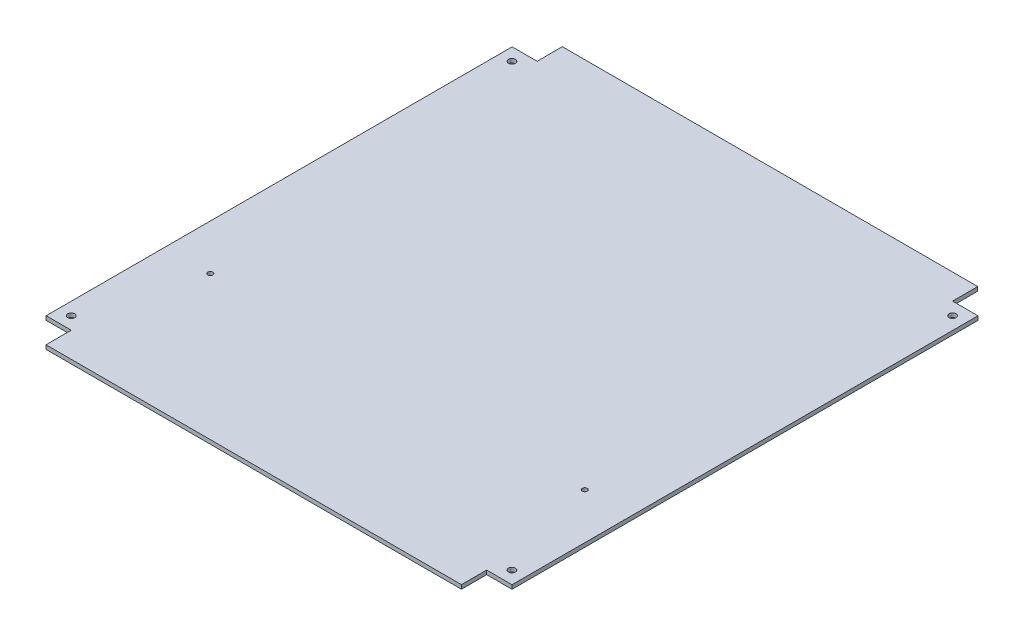
ISO-10303-21;
HEADER;
FILE_DESCRIPTION(('STEP AP214'),'2;1');
FILE_NAME('part.step','',(''),(''),'','','');
FILE_SCHEMA(('AUTOMOTIVE_DESIGN { 1 0 10303 214 1 1 1 1 }'));
ENDSEC;
DATA;
#1=APPLICATION_CONTEXT('core data for automotive mechanical design processes');
#2=APPLICATION_PROTOCOL_DEFINITION('international standard','automotive_design',2000,#1);
#3=PRODUCT_CONTEXT('',#1,'mechanical');
#4=PRODUCT('Part','Part','',(#3));
#5=PRODUCT_RELATED_PRODUCT_CATEGORY('part','',(#4));
#6=PRODUCT_DEFINITION_FORMATION('','',#4);
#7=PRODUCT_DEFINITION_CONTEXT('part definition',#1,'design');
#8=PRODUCT_DEFINITION('design','',#6,#7);
#9=PRODUCT_DEFINITION_SHAPE('','',#8);
#10=(LENGTH_UNIT() NAMED_UNIT(*) SI_UNIT(.MILLI.,.METRE.));
#11=(NAMED_UNIT(*) PLANE_ANGLE_UNIT() SI_UNIT($,.RADIAN.));
#12=(NAMED_UNIT(*) SI_UNIT($,.STERADIAN.) SOLID_ANGLE_UNIT());
#13=UNCERTAINTY_MEASURE_WITH_UNIT(LENGTH_MEASURE(1.E-05),#10,'distance_accuracy_value','');
#14=(GEOMETRIC_REPRESENTATION_CONTEXT(3) GLOBAL_UNCERTAINTY_ASSIGNED_CONTEXT((#13)) GLOBAL_UNIT_ASSIGNED_CONTEXT((#10,
#11,#12)) REPRESENTATION_CONTEXT('',''));
#15=CARTESIAN_POINT('',(0.,0.,0.));
#16=DIRECTION('',(0.,0.,1.));
#17=DIRECTION('',(1.,0.,0.));
#18=AXIS2_PLACEMENT_3D('',#15,#16,#17);
#19=CARTESIAN_POINT('',(164.819359939751,3.175,204.974359939332));
#20=DIRECTION('',(0.,0.,-1.));
#21=DIRECTION('',(-1.,0.,0.));
#22=AXIS2_PLACEMENT_3D('',#19,#20,#21);
#23=PLANE('',#22);
#24=DIRECTION('',(1.,0.,0.));
#25=VECTOR('',#24,1.);
#26=CARTESIAN_POINT('',(164.819359939751,0.,204.974359939332));
#27=LINE('',#26,#25);
#28=CARTESIAN_POINT('',(-164.755640060249,0.,204.974359939332));
#29=VERTEX_POINT('',#28);
#30=CARTESIAN_POINT('',(164.819359939751,0.,204.974359939332));
#31=VERTEX_POINT('',#30);
#32=EDGE_CURVE('E110',#29,#31,#27,.T.);
#33=ORIENTED_EDGE('',*,*,#32,.T.);
#34=DIRECTION('',(0.,-1.,0.));
#35=VECTOR('',#34,1.);
#36=CARTESIAN_POINT('',(164.819359939751,3.175,204.974359939332));
#37=LINE('',#36,#35);
#38=CARTESIAN_POINT('',(164.819359939751,3.175,204.974359939332));
#39=VERTEX_POINT('',#38);
#40=EDGE_CURVE('E11',#39,#31,#37,.T.);
#41=ORIENTED_EDGE('',*,*,#40,.F.);
#42=DIRECTION('',(1.,0.,0.));
#43=VECTOR('',#42,1.);
#44=CARTESIAN_POINT('',(-163.362720716725,3.175,204.974359939332));
#45=LINE('',#44,#43);
#46=CARTESIAN_POINT('',(-164.755640060249,3.175,204.974359939332));
#47=VERTEX_POINT('',#46);
#48=EDGE_CURVE('E116',#47,#39,#45,.T.);
#49=ORIENTED_EDGE('',*,*,#48,.F.);
#50=DIRECTION('',(0.,-1.,0.));
#51=VECTOR('',#50,1.);
#52=CARTESIAN_POINT('',(-164.755640060249,3.175,204.974359939332));
#53=LINE('',#52,#51);
#54=EDGE_CURVE('E166',#47,#29,#53,.T.);
#55=ORIENTED_EDGE('',*,*,#54,.T.);
#56=EDGE_LOOP('',(#33,#41,#49,#55));
#57=FACE_BOUND('',#56,.T.);
#58=ADVANCED_FACE('F45',(#57),#23,.F.);
#59=CARTESIAN_POINT('',(164.819359939751,3.175,184.974359939332));
#60=DIRECTION('',(-1.,0.,0.));
#61=DIRECTION('',(0.,0.,1.));
#62=AXIS2_PLACEMENT_3D('',#59,#60,#61);
#63=PLANE('',#62);
#64=DIRECTION('',(0.,0.,-1.));
#65=VECTOR('',#64,1.);
#66=CARTESIAN_POINT('',(164.819359939751,0.,184.974359939332));
#67=LINE('',#66,#65);
#68=CARTESIAN_POINT('',(164.819359939751,0.,184.974359939332));
#69=VERTEX_POINT('',#68);
#70=EDGE_CURVE('E172',#31,#69,#67,.T.);
#71=ORIENTED_EDGE('',*,*,#70,.T.);
#72=DIRECTION('',(0.,-1.,0.));
#73=VECTOR('',#72,1.);
#74=CARTESIAN_POINT('',(164.819359939751,3.175,184.974359939332));
#75=LINE('',#74,#73);
#76=CARTESIAN_POINT('',(164.819359939751,3.175,184.974359939332));
#77=VERTEX_POINT('',#76);
#78=EDGE_CURVE('E54',#77,#69,#75,.T.);
#79=ORIENTED_EDGE('',*,*,#78,.F.);
#80=DIRECTION('',(0.,0.,-1.));
#81=VECTOR('',#80,1.);
#82=CARTESIAN_POINT('',(164.819359939751,3.175,184.974359939332));
#83=LINE('',#82,#81);
#84=EDGE_CURVE('E289',#39,#77,#83,.T.);
#85=ORIENTED_EDGE('',*,*,#84,.F.);
#86=ORIENTED_EDGE('',*,*,#40,.T.);
#87=EDGE_LOOP('',(#71,#79,#85,#86));
#88=FACE_BOUND('',#87,.T.);
#89=ADVANCED_FACE('F296',(#88),#63,.F.);
#90=CARTESIAN_POINT('',(184.929359939613,3.175,184.974359939332));
#91=DIRECTION('',(0.,0.,-1.));
#92=DIRECTION('',(-1.,0.,0.));
#93=AXIS2_PLACEMENT_3D('',#90,#91,#92);
#94=PLANE('',#93);
#95=DIRECTION('',(1.,0.,0.));
#96=VECTOR('',#95,1.);
#97=CARTESIAN_POINT('',(184.929359939613,0.,184.974359939332));
#98=LINE('',#97,#96);
#99=CARTESIAN_POINT('',(184.929359939613,0.,184.974359939332));
#100=VERTEX_POINT('',#99);
#101=EDGE_CURVE('E176',#69,#100,#98,.T.);
#102=ORIENTED_EDGE('',*,*,#101,.T.);
#103=DIRECTION('',(0.,-1.,0.));
#104=VECTOR('',#103,1.);
#105=CARTESIAN_POINT('',(184.929359939613,3.175,184.974359939332));
#106=LINE('',#105,#104);
#107=CARTESIAN_POINT('',(184.929359939613,3.175,184.974359939332));
#108=VERTEX_POINT('',#107);
#109=EDGE_CURVE('E231',#108,#100,#106,.T.);
#110=ORIENTED_EDGE('',*,*,#109,.F.);
#111=DIRECTION('',(1.,0.,0.));
#112=VECTOR('',#111,1.);
#113=CARTESIAN_POINT('',(184.929359939613,3.175,184.974359939332));
#114=LINE('',#113,#112);
#115=EDGE_CURVE('E242',#77,#108,#114,.T.);
#116=ORIENTED_EDGE('',*,*,#115,.F.);
#117=ORIENTED_EDGE('',*,*,#78,.T.);
#118=EDGE_LOOP('',(#102,#110,#116,#117));
#119=FACE_BOUND('',#118,.T.);
#120=ADVANCED_FACE('F240',(#119),#94,.F.);
#121=CARTESIAN_POINT('',(185.019359939556,3.175,-184.610640060281));
#122=DIRECTION('',(-0.999999970349889,0.,-0.000243516369101674));
#123=DIRECTION('',(-0.000243516369101674,0.,0.999999970349889));
#124=AXIS2_PLACEMENT_3D('',#121,#122,#123);
#125=PLANE('',#124);
#126=DIRECTION('',(0.000243516369101674,0.,-0.999999970349889));
#127=VECTOR('',#126,1.);
#128=CARTESIAN_POINT('',(185.019359939556,0.,-184.610640060281));
#129=LINE('',#128,#127);
#130=CARTESIAN_POINT('',(185.019359939556,0.,-184.610640060281));
#131=VERTEX_POINT('',#130);
#132=EDGE_CURVE('E179',#100,#131,#129,.T.);
#133=ORIENTED_EDGE('',*,*,#132,.T.);
#134=DIRECTION('',(0.,-1.,0.));
#135=VECTOR('',#134,1.);
#136=CARTESIAN_POINT('',(185.019359939556,3.175,-184.610640060281));
#137=LINE('',#136,#135);
#138=CARTESIAN_POINT('',(185.019359939556,3.175,-184.610640060281));
#139=VERTEX_POINT('',#138);
#140=EDGE_CURVE('E227',#139,#131,#137,.T.);
#141=ORIENTED_EDGE('',*,*,#140,.F.);
#142=DIRECTION('',(0.000243516369101674,0.,-0.999999970349889));
#143=VECTOR('',#142,1.);
#144=CARTESIAN_POINT('',(185.019359939556,3.175,-184.610640060281));
#145=LINE('',#144,#143);
#146=EDGE_CURVE('E261',#108,#139,#145,.T.);
#147=ORIENTED_EDGE('',*,*,#146,.F.);
#148=ORIENTED_EDGE('',*,*,#109,.T.);
#149=EDGE_LOOP('',(#133,#141,#147,#148));
#150=FACE_BOUND('',#149,.T.);
#151=ADVANCED_FACE('F251',(#150),#125,.F.);
#152=CARTESIAN_POINT('',(164.819359939752,3.175,-184.610640060281));
#153=DIRECTION('',(0.,0.,1.));
#154=DIRECTION('',(1.,0.,0.));
#155=AXIS2_PLACEMENT_3D('',#152,#153,#154);
#156=PLANE('',#155);
#157=DIRECTION('',(-1.,0.,0.));
#158=VECTOR('',#157,1.);
#159=CARTESIAN_POINT('',(164.819359939752,0.,-184.610640060281));
#160=LINE('',#159,#158);
#161=CARTESIAN_POINT('',(164.819359939752,0.,-184.610640060281));
#162=VERTEX_POINT('',#161);
#163=EDGE_CURVE('E182',#131,#162,#160,.T.);
#164=ORIENTED_EDGE('',*,*,#163,.T.);
#165=DIRECTION('',(0.,-1.,0.));
#166=VECTOR('',#165,1.);
#167=CARTESIAN_POINT('',(164.819359939752,3.175,-184.610640060281));
#168=LINE('',#167,#166);
#169=CARTESIAN_POINT('',(164.819359939752,3.175,-184.610640060281));
#170=VERTEX_POINT('',#169);
#171=EDGE_CURVE('E223',#170,#162,#168,.T.);
#172=ORIENTED_EDGE('',*,*,#171,.F.);
#173=DIRECTION('',(-1.,0.,0.));
#174=VECTOR('',#173,1.);
#175=CARTESIAN_POINT('',(164.819359939752,3.175,-184.610640060281));
#176=LINE('',#175,#174);
#177=EDGE_CURVE('E257',#139,#170,#176,.T.);
#178=ORIENTED_EDGE('',*,*,#177,.F.);
#179=ORIENTED_EDGE('',*,*,#140,.T.);
#180=EDGE_LOOP('',(#164,#172,#178,#179));
#181=FACE_BOUND('',#180,.T.);
#182=ADVANCED_FACE('F255',(#181),#156,.F.);
#183=CARTESIAN_POINT('',(164.819359939752,3.175,-204.610640060181));
#184=DIRECTION('',(-1.,0.,0.));
#185=DIRECTION('',(0.,0.,1.));
#186=AXIS2_PLACEMENT_3D('',#183,#184,#185);
#187=PLANE('',#186);
#188=DIRECTION('',(0.,0.,-1.));
#189=VECTOR('',#188,1.);
#190=CARTESIAN_POINT('',(164.819359939752,0.,-204.610640060181));
#191=LINE('',#190,#189);
#192=CARTESIAN_POINT('',(164.819359939752,0.,-204.610640060181));
#193=VERTEX_POINT('',#192);
#194=EDGE_CURVE('E185',#162,#193,#191,.T.);
#195=ORIENTED_EDGE('',*,*,#194,.T.);
#196=DIRECTION('',(0.,-1.,0.));
#197=VECTOR('',#196,1.);
#198=CARTESIAN_POINT('',(164.819359939752,3.175,-204.610640060181));
#199=LINE('',#198,#197);
#200=CARTESIAN_POINT('',(164.819359939752,3.175,-204.610640060181));
#201=VERTEX_POINT('',#200);
#202=EDGE_CURVE('E219',#201,#193,#199,.T.);
#203=ORIENTED_EDGE('',*,*,#202,.F.);
#204=DIRECTION('',(0.,0.,-1.));
#205=VECTOR('',#204,1.);
#206=CARTESIAN_POINT('',(164.819359939752,3.175,-204.610640060181));
#207=LINE('',#206,#205);
#208=EDGE_CURVE('E260',#170,#201,#207,.T.);
#209=ORIENTED_EDGE('',*,*,#208,.F.);
#210=ORIENTED_EDGE('',*,*,#171,.T.);
#211=EDGE_LOOP('',(#195,#203,#209,#210));
#212=FACE_BOUND('',#211,.T.);
#213=ADVANCED_FACE('F308',(#212),#187,.F.);
#214=CARTESIAN_POINT('',(-164.755640060248,3.175,-204.610640060181));
#215=DIRECTION('',(0.,0.,1.));
#216=DIRECTION('',(1.,0.,0.));
#217=AXIS2_PLACEMENT_3D('',#214,#215,#216);
#218=PLANE('',#217);
#219=DIRECTION('',(-1.,0.,0.));
#220=VECTOR('',#219,1.);
#221=CARTESIAN_POINT('',(-164.755640060248,0.,-204.610640060181));
#222=LINE('',#221,#220);
#223=CARTESIAN_POINT('',(-164.755640060248,0.,-204.610640060181));
#224=VERTEX_POINT('',#223);
#225=EDGE_CURVE('E188',#193,#224,#222,.T.);
#226=ORIENTED_EDGE('',*,*,#225,.T.);
#227=DIRECTION('',(0.,-1.,0.));
#228=VECTOR('',#227,1.);
#229=CARTESIAN_POINT('',(-164.755640060248,3.175,-204.610640060181));
#230=LINE('',#229,#228);
#231=CARTESIAN_POINT('',(-164.755640060248,3.175,-204.610640060181));
#232=VERTEX_POINT('',#231);
#233=EDGE_CURVE('E215',#232,#224,#230,.T.);
#234=ORIENTED_EDGE('',*,*,#233,.F.);
#235=DIRECTION('',(-1.,0.,0.));
#236=VECTOR('',#235,1.);
#237=CARTESIAN_POINT('',(-164.755640060248,3.175,-204.610640060181));
#238=LINE('',#237,#236);
#239=EDGE_CURVE('E265',#201,#232,#238,.T.);
#240=ORIENTED_EDGE('',*,*,#239,.F.);
#241=ORIENTED_EDGE('',*,*,#202,.T.);
#242=EDGE_LOOP('',(#226,#234,#240,#241));
#243=FACE_BOUND('',#242,.T.);
#244=ADVANCED_FACE('F311',(#243),#218,.F.);
#245=CARTESIAN_POINT('',(-164.655640060405,3.175,-184.61064006028));
#246=DIRECTION('',(0.999987500234409,0.,-0.0049999374933707));
#247=DIRECTION('',(-0.0049999374933707,0.,-0.999987500234409));
#248=AXIS2_PLACEMENT_3D('',#245,#246,#247);
#249=PLANE('',#248);
#250=DIRECTION('',(0.0049999374933707,0.,0.999987500234409));
#251=VECTOR('',#250,1.);
#252=CARTESIAN_POINT('',(-164.655640060405,0.,-184.61064006028));
#253=LINE('',#252,#251);
#254=CARTESIAN_POINT('',(-164.655640060405,0.,-184.61064006028));
#255=VERTEX_POINT('',#254);
#256=EDGE_CURVE('E191',#224,#255,#253,.T.);
#257=ORIENTED_EDGE('',*,*,#256,.T.);
#258=DIRECTION('',(0.,-1.,0.));
#259=VECTOR('',#258,1.);
#260=CARTESIAN_POINT('',(-164.655640060405,3.175,-184.61064006028));
#261=LINE('',#260,#259);
#262=CARTESIAN_POINT('',(-164.655640060405,3.175,-184.61064006028));
#263=VERTEX_POINT('',#262);
#264=EDGE_CURVE('E211',#263,#255,#261,.T.);
#265=ORIENTED_EDGE('',*,*,#264,.F.);
#266=DIRECTION('',(0.0049999374933707,0.,0.999987500234409));
#267=VECTOR('',#266,1.);
#268=CARTESIAN_POINT('',(-164.655640060405,3.175,-184.61064006028));
#269=LINE('',#268,#267);
#270=EDGE_CURVE('E272',#232,#263,#269,.T.);
#271=ORIENTED_EDGE('',*,*,#270,.F.);
#272=ORIENTED_EDGE('',*,*,#233,.T.);
#273=EDGE_LOOP('',(#257,#265,#271,#272));
#274=FACE_BOUND('',#273,.T.);
#275=ADVANCED_FACE('F280',(#274),#249,.F.);
#276=CARTESIAN_POINT('',(-184.555640060444,3.175,-184.61064006028));
#277=DIRECTION('',(0.,0.,1.));
#278=DIRECTION('',(1.,0.,0.));
#279=AXIS2_PLACEMENT_3D('',#276,#277,#278);
#280=PLANE('',#279);
#281=DIRECTION('',(-1.,0.,0.));
#282=VECTOR('',#281,1.);
#283=CARTESIAN_POINT('',(-184.555640060444,0.,-184.61064006028));
#284=LINE('',#283,#282);
#285=CARTESIAN_POINT('',(-184.555640060444,0.,-184.61064006028));
#286=VERTEX_POINT('',#285);
#287=EDGE_CURVE('E194',#255,#286,#284,.T.);
#288=ORIENTED_EDGE('',*,*,#287,.T.);
#289=DIRECTION('',(0.,-1.,0.));
#290=VECTOR('',#289,1.);
#291=CARTESIAN_POINT('',(-184.555640060444,3.175,-184.61064006028));
#292=LINE('',#291,#290);
#293=CARTESIAN_POINT('',(-184.555640060444,3.175,-184.61064006028));
#294=VERTEX_POINT('',#293);
#295=EDGE_CURVE('E159',#294,#286,#292,.T.);
#296=ORIENTED_EDGE('',*,*,#295,.F.);
#297=DIRECTION('',(-1.,0.,0.));
#298=VECTOR('',#297,1.);
#299=CARTESIAN_POINT('',(-184.555640060444,3.175,-184.61064006028));
#300=LINE('',#299,#298);
#301=EDGE_CURVE('E148',#263,#294,#300,.T.);
#302=ORIENTED_EDGE('',*,*,#301,.F.);
#303=ORIENTED_EDGE('',*,*,#264,.T.);
#304=EDGE_LOOP('',(#288,#296,#302,#303));
#305=FACE_BOUND('',#304,.T.);
#306=ADVANCED_FACE('F284',(#305),#280,.F.);
#307=CARTESIAN_POINT('',(-184.655640060405,3.175,184.974359939332));
#308=DIRECTION('',(0.999999963394924,0.,0.000270573741630796));
#309=DIRECTION('',(0.000270573741630796,0.,-0.999999963394925));
#310=AXIS2_PLACEMENT_3D('',#307,#308,#309);
#311=PLANE('',#310);
#312=DIRECTION('',(-0.000270573741630796,0.,0.999999963394924));
#313=VECTOR('',#312,1.);
#314=CARTESIAN_POINT('',(-184.655640060405,0.,184.974359939332));
#315=LINE('',#314,#313);
#316=CARTESIAN_POINT('',(-184.655640060405,0.,184.974359939332));
#317=VERTEX_POINT('',#316);
#318=EDGE_CURVE('E157',#286,#317,#315,.T.);
#319=ORIENTED_EDGE('',*,*,#318,.T.);
#320=DIRECTION('',(0.,-1.,0.));
#321=VECTOR('',#320,1.);
#322=CARTESIAN_POINT('',(-184.655640060405,3.175,184.974359939332));
#323=LINE('',#322,#321);
#324=CARTESIAN_POINT('',(-184.655640060405,3.175,184.974359939332));
#325=VERTEX_POINT('',#324);
#326=EDGE_CURVE('E154',#325,#317,#323,.T.);
#327=ORIENTED_EDGE('',*,*,#326,.F.);
#328=DIRECTION('',(-0.000270573741630796,0.,0.999999963394924));
#329=VECTOR('',#328,1.);
#330=CARTESIAN_POINT('',(-184.655640060405,3.175,184.974359939332));
#331=LINE('',#330,#329);
#332=EDGE_CURVE('E142',#294,#325,#331,.T.);
#333=ORIENTED_EDGE('',*,*,#332,.F.);
#334=ORIENTED_EDGE('',*,*,#295,.T.);
#335=EDGE_LOOP('',(#319,#327,#333,#334));
#336=FACE_BOUND('',#335,.T.);
#337=ADVANCED_FACE('F155',(#336),#311,.F.);
#338=CARTESIAN_POINT('',(-164.755640060249,3.175,184.974359939332));
#339=DIRECTION('',(0.,0.,-1.));
#340=DIRECTION('',(-1.,0.,0.));
#341=AXIS2_PLACEMENT_3D('',#338,#339,#340);
#342=PLANE('',#341);
#343=DIRECTION('',(1.,0.,0.));
#344=VECTOR('',#343,1.);
#345=CARTESIAN_POINT('',(-164.755640060249,0.,184.974359939332));
#346=LINE('',#345,#344);
#347=CARTESIAN_POINT('',(-164.755640060249,0.,184.974359939332));
#348=VERTEX_POINT('',#347);
#349=EDGE_CURVE('E103',#317,#348,#346,.T.);
#350=ORIENTED_EDGE('',*,*,#349,.T.);
#351=DIRECTION('',(0.,-1.,0.));
#352=VECTOR('',#351,1.);
#353=CARTESIAN_POINT('',(-164.755640060249,3.175,184.974359939332));
#354=LINE('',#353,#352);
#355=CARTESIAN_POINT('',(-164.755640060249,3.175,184.974359939332));
#356=VERTEX_POINT('',#355);
#357=EDGE_CURVE('E160',#356,#348,#354,.T.);
#358=ORIENTED_EDGE('',*,*,#357,.F.);
#359=DIRECTION('',(1.,0.,0.));
#360=VECTOR('',#359,1.);
#361=CARTESIAN_POINT('',(-164.755640060249,3.175,184.974359939332));
#362=LINE('',#361,#360);
#363=EDGE_CURVE('E146',#325,#356,#362,.T.);
#364=ORIENTED_EDGE('',*,*,#363,.F.);
#365=ORIENTED_EDGE('',*,*,#326,.T.);
#366=EDGE_LOOP('',(#350,#358,#364,#365));
#367=FACE_BOUND('',#366,.T.);
#368=ADVANCED_FACE('F162',(#367),#342,.F.);
#369=CARTESIAN_POINT('',(-164.755640060249,3.175,204.974359939332));
#370=DIRECTION('',(1.,0.,0.));
#371=DIRECTION('',(0.,0.,-1.));
#372=AXIS2_PLACEMENT_3D('',#369,#370,#371);
#373=PLANE('',#372);
#374=DIRECTION('',(0.,0.,1.));
#375=VECTOR('',#374,1.);
#376=CARTESIAN_POINT('',(-164.755640060249,0.,204.974359939332));
#377=LINE('',#376,#375);
#378=EDGE_CURVE('E201',#348,#29,#377,.T.);
#379=ORIENTED_EDGE('',*,*,#378,.T.);
#380=ORIENTED_EDGE('',*,*,#54,.F.);
#381=DIRECTION('',(0.,0.,1.));
#382=VECTOR('',#381,1.);
#383=CARTESIAN_POINT('',(-164.755640060249,3.175,204.974359939332));
#384=LINE('',#383,#382);
#385=EDGE_CURVE('E62',#356,#47,#384,.T.);
#386=ORIENTED_EDGE('',*,*,#385,.F.);
#387=ORIENTED_EDGE('',*,*,#357,.T.);
#388=EDGE_LOOP('',(#379,#380,#386,#387));
#389=FACE_BOUND('',#388,.T.);
#390=ADVANCED_FACE('F286',(#389),#373,.F.);
#391=CARTESIAN_POINT('',(0.,3.175,0.));
#392=DIRECTION('',(0.,-1.,0.));
#393=DIRECTION('',(0.,0.,-1.));
#394=AXIS2_PLACEMENT_3D('',#391,#392,#393);
#395=PLANE('',#394);
#396=CARTESIAN_POINT('',(-148.503140060017,3.175,90.8983599393329));
#397=DIRECTION('',(0.,1.,0.));
#398=DIRECTION('',(0.,0.,1.));
#399=AXIS2_PLACEMENT_3D('',#396,#397,#398);
#400=CIRCLE('',#399,2.);
#401=CARTESIAN_POINT('',(-148.503140060017,3.175,92.8983599393329));
#402=VERTEX_POINT('',#401);
#403=EDGE_CURVE('E360',#402,#402,#400,.T.);
#404=ORIENTED_EDGE('',*,*,#403,.F.);
#405=EDGE_LOOP('',(#404));
#406=FACE_BOUND('',#405,.T.);
#407=CARTESIAN_POINT('',(148.556859940004,3.175,90.8983599393333));
#408=DIRECTION('',(0.,1.,0.));
#409=DIRECTION('',(0.,0.,1.));
#410=AXIS2_PLACEMENT_3D('',#407,#408,#409);
#411=CIRCLE('',#410,2.);
#412=CARTESIAN_POINT('',(148.556859940004,3.175,92.8983599393333));
#413=VERTEX_POINT('',#412);
#414=EDGE_CURVE('E372',#413,#413,#411,.T.);
#415=ORIENTED_EDGE('',*,*,#414,.F.);
#416=EDGE_LOOP('',(#415));
#417=FACE_BOUND('',#416,.T.);
#418=CARTESIAN_POINT('',(-174.705640060328,3.175,-174.600639694617));
#419=DIRECTION('',(0.,1.,0.));
#420=DIRECTION('',(0.,0.,1.));
#421=AXIS2_PLACEMENT_3D('',#418,#419,#420);
#422=CIRCLE('',#421,2.75000000000001);
#423=CARTESIAN_POINT('',(-174.705640060328,3.175,-171.850639694617));
#424=VERTEX_POINT('',#423);
#425=EDGE_CURVE('E370',#424,#424,#422,.T.);
#426=ORIENTED_EDGE('',*,*,#425,.F.);
#427=EDGE_LOOP('',(#426));
#428=FACE_BOUND('',#427,.T.);
#429=CARTESIAN_POINT('',(174.869359939672,3.175,-174.600639694617));
#430=DIRECTION('',(0.,1.,0.));
#431=DIRECTION('',(0.,0.,1.));
#432=AXIS2_PLACEMENT_3D('',#429,#430,#431);
#433=CIRCLE('',#432,2.75000000000001);
#434=CARTESIAN_POINT('',(174.869359939672,3.175,-171.850639694617));
#435=VERTEX_POINT('',#434);
#436=EDGE_CURVE('E387',#435,#435,#433,.T.);
#437=ORIENTED_EDGE('',*,*,#436,.F.);
#438=EDGE_LOOP('',(#437));
#439=FACE_BOUND('',#438,.T.);
#440=CARTESIAN_POINT('',(174.869359939673,3.175,174.974360305383));
#441=DIRECTION('',(0.,1.,0.));
#442=DIRECTION('',(0.,0.,1.));
#443=AXIS2_PLACEMENT_3D('',#440,#441,#442);
#444=CIRCLE('',#443,2.75000000000001);
#445=CARTESIAN_POINT('',(174.869359939673,3.175,177.724360305383));
#446=VERTEX_POINT('',#445);
#447=EDGE_CURVE('E386',#446,#446,#444,.T.);
#448=ORIENTED_EDGE('',*,*,#447,.F.);
#449=EDGE_LOOP('',(#448));
#450=FACE_BOUND('',#449,.T.);
#451=CARTESIAN_POINT('',(-174.705640060327,3.175,174.974360305383));
#452=DIRECTION('',(0.,1.,0.));
#453=DIRECTION('',(0.,0.,1.));
#454=AXIS2_PLACEMENT_3D('',#451,#452,#453);
#455=CIRCLE('',#454,2.75000000000001);
#456=CARTESIAN_POINT('',(-174.705640060327,3.175,177.724360305383));
#457=VERTEX_POINT('',#456);
#458=EDGE_CURVE('E391',#457,#457,#455,.T.);
#459=ORIENTED_EDGE('',*,*,#458,.F.);
#460=EDGE_LOOP('',(#459));
#461=FACE_BOUND('',#460,.T.);
#462=ORIENTED_EDGE('',*,*,#48,.T.);
#463=ORIENTED_EDGE('',*,*,#84,.T.);
#464=ORIENTED_EDGE('',*,*,#115,.T.);
#465=ORIENTED_EDGE('',*,*,#146,.T.);
#466=ORIENTED_EDGE('',*,*,#177,.T.);
#467=ORIENTED_EDGE('',*,*,#208,.T.);
#468=ORIENTED_EDGE('',*,*,#239,.T.);
#469=ORIENTED_EDGE('',*,*,#270,.T.);
#470=ORIENTED_EDGE('',*,*,#301,.T.);
#471=ORIENTED_EDGE('',*,*,#332,.T.);
#472=ORIENTED_EDGE('',*,*,#363,.T.);
#473=ORIENTED_EDGE('',*,*,#385,.T.);
#474=EDGE_LOOP('',(#462,#463,#464,#465,#466,#467,#468,#469,#470,#471,#472,#473));
#475=FACE_BOUND('',#474,.T.);
#476=ADVANCED_FACE('F144',(#406,#417,#428,#439,#450,#461,#475),#395,.F.);
#477=CARTESIAN_POINT('',(0.,0.,0.));
#478=DIRECTION('',(0.,-1.,0.));
#479=DIRECTION('',(0.,0.,-1.));
#480=AXIS2_PLACEMENT_3D('',#477,#478,#479);
#481=PLANE('',#480);
#482=CARTESIAN_POINT('',(-148.503140060017,0.,90.8983599393329));
#483=DIRECTION('',(0.,-1.,0.));
#484=DIRECTION('',(0.,0.,-1.));
#485=AXIS2_PLACEMENT_3D('',#482,#483,#484);
#486=CIRCLE('',#485,2.);
#487=CARTESIAN_POINT('',(-148.503140060017,0.,88.8983599393329));
#488=VERTEX_POINT('',#487);
#489=EDGE_CURVE('E363',#488,#488,#486,.F.);
#490=ORIENTED_EDGE('',*,*,#489,.T.);
#491=EDGE_LOOP('',(#490));
#492=FACE_BOUND('',#491,.T.);
#493=CARTESIAN_POINT('',(148.556859940004,0.,90.8983599393333));
#494=DIRECTION('',(0.,-1.,0.));
#495=DIRECTION('',(0.,0.,-1.));
#496=AXIS2_PLACEMENT_3D('',#493,#494,#495);
#497=CIRCLE('',#496,2.);
#498=CARTESIAN_POINT('',(148.556859940004,0.,88.8983599393333));
#499=VERTEX_POINT('',#498);
#500=EDGE_CURVE('E375',#499,#499,#497,.F.);
#501=ORIENTED_EDGE('',*,*,#500,.T.);
#502=EDGE_LOOP('',(#501));
#503=FACE_BOUND('',#502,.T.);
#504=CARTESIAN_POINT('',(-174.705640060328,0.,-174.600639694617));
#505=DIRECTION('',(0.,-1.,0.));
#506=DIRECTION('',(0.,0.,-1.));
#507=AXIS2_PLACEMENT_3D('',#504,#505,#506);
#508=CIRCLE('',#507,2.75000000000001);
#509=CARTESIAN_POINT('',(-174.705640060328,0.,-177.350639694617));
#510=VERTEX_POINT('',#509);
#511=EDGE_CURVE('E365',#510,#510,#508,.F.);
#512=ORIENTED_EDGE('',*,*,#511,.T.);
#513=EDGE_LOOP('',(#512));
#514=FACE_BOUND('',#513,.T.);
#515=CARTESIAN_POINT('',(174.869359939672,0.,-174.600639694617));
#516=DIRECTION('',(0.,-1.,0.));
#517=DIRECTION('',(0.,0.,-1.));
#518=AXIS2_PLACEMENT_3D('',#515,#516,#517);
#519=CIRCLE('',#518,2.75000000000001);
#520=CARTESIAN_POINT('',(174.869359939672,0.,-177.350639694617));
#521=VERTEX_POINT('',#520);
#522=EDGE_CURVE('E392',#521,#521,#519,.F.);
#523=ORIENTED_EDGE('',*,*,#522,.T.);
#524=EDGE_LOOP('',(#523));
#525=FACE_BOUND('',#524,.T.);
#526=CARTESIAN_POINT('',(174.869359939673,0.,174.974360305383));
#527=DIRECTION('',(0.,-1.,0.));
#528=DIRECTION('',(0.,0.,-1.));
#529=AXIS2_PLACEMENT_3D('',#526,#527,#528);
#530=CIRCLE('',#529,2.75000000000001);
#531=CARTESIAN_POINT('',(174.869359939673,0.,172.224360305383));
#532=VERTEX_POINT('',#531);
#533=EDGE_CURVE('E382',#532,#532,#530,.F.);
#534=ORIENTED_EDGE('',*,*,#533,.T.);
#535=EDGE_LOOP('',(#534));
#536=FACE_BOUND('',#535,.T.);
#537=CARTESIAN_POINT('',(-174.705640060327,0.,174.974360305383));
#538=DIRECTION('',(0.,-1.,0.));
#539=DIRECTION('',(0.,0.,-1.));
#540=AXIS2_PLACEMENT_3D('',#537,#538,#539);
#541=CIRCLE('',#540,2.75000000000001);
#542=CARTESIAN_POINT('',(-174.705640060327,0.,172.224360305383));
#543=VERTEX_POINT('',#542);
#544=EDGE_CURVE('E173',#543,#543,#541,.F.);
#545=ORIENTED_EDGE('',*,*,#544,.T.);
#546=EDGE_LOOP('',(#545));
#547=FACE_BOUND('',#546,.T.);
#548=ORIENTED_EDGE('',*,*,#32,.F.);
#549=ORIENTED_EDGE('',*,*,#378,.F.);
#550=ORIENTED_EDGE('',*,*,#349,.F.);
#551=ORIENTED_EDGE('',*,*,#318,.F.);
#552=ORIENTED_EDGE('',*,*,#287,.F.);
#553=ORIENTED_EDGE('',*,*,#256,.F.);
#554=ORIENTED_EDGE('',*,*,#225,.F.);
#555=ORIENTED_EDGE('',*,*,#194,.F.);
#556=ORIENTED_EDGE('',*,*,#163,.F.);
#557=ORIENTED_EDGE('',*,*,#132,.F.);
#558=ORIENTED_EDGE('',*,*,#101,.F.);
#559=ORIENTED_EDGE('',*,*,#70,.F.);
#560=EDGE_LOOP('',(#548,#549,#550,#551,#552,#553,#554,#555,#556,#557,#558,#559));
#561=FACE_BOUND('',#560,.T.);
#562=ADVANCED_FACE('F246',(#492,#503,#514,#525,#536,#547,#561),#481,.T.);
#563=CARTESIAN_POINT('',(-174.705640060327,-7.77817459305203,174.974360305383));
#564=DIRECTION('',(0.,1.,0.));
#565=DIRECTION('',(0.,0.,1.));
#566=AXIS2_PLACEMENT_3D('',#563,#564,#565);
#567=CYLINDRICAL_SURFACE('',#566,2.75000000000001);
#568=ORIENTED_EDGE('',*,*,#458,.T.);
#569=EDGE_LOOP('',(#568));
#570=FACE_BOUND('',#569,.T.);
#571=ORIENTED_EDGE('',*,*,#544,.F.);
#572=EDGE_LOOP('',(#571));
#573=FACE_BOUND('',#572,.T.);
#574=ADVANCED_FACE('F328',(#570,#573),#567,.F.);
#575=CARTESIAN_POINT('',(174.869359939673,-7.77817459305203,174.974360305383));
#576=DIRECTION('',(0.,1.,0.));
#577=DIRECTION('',(0.,0.,1.));
#578=AXIS2_PLACEMENT_3D('',#575,#576,#577);
#579=CYLINDRICAL_SURFACE('',#578,2.75000000000001);
#580=ORIENTED_EDGE('',*,*,#447,.T.);
#581=EDGE_LOOP('',(#580));
#582=FACE_BOUND('',#581,.T.);
#583=ORIENTED_EDGE('',*,*,#533,.F.);
#584=EDGE_LOOP('',(#583));
#585=FACE_BOUND('',#584,.T.);
#586=ADVANCED_FACE('F335',(#582,#585),#579,.F.);
#587=CARTESIAN_POINT('',(174.869359939672,-7.77817459305203,-174.600639694617));
#588=DIRECTION('',(0.,1.,0.));
#589=DIRECTION('',(0.,0.,1.));
#590=AXIS2_PLACEMENT_3D('',#587,#588,#589);
#591=CYLINDRICAL_SURFACE('',#590,2.75000000000001);
#592=ORIENTED_EDGE('',*,*,#436,.T.);
#593=EDGE_LOOP('',(#592));
#594=FACE_BOUND('',#593,.T.);
#595=ORIENTED_EDGE('',*,*,#522,.F.);
#596=EDGE_LOOP('',(#595));
#597=FACE_BOUND('',#596,.T.);
#598=ADVANCED_FACE('F341',(#594,#597),#591,.F.);
#599=CARTESIAN_POINT('',(-174.705640060328,-7.77817459305203,-174.600639694617));
#600=DIRECTION('',(0.,1.,0.));
#601=DIRECTION('',(0.,0.,1.));
#602=AXIS2_PLACEMENT_3D('',#599,#600,#601);
#603=CYLINDRICAL_SURFACE('',#602,2.75000000000001);
#604=ORIENTED_EDGE('',*,*,#425,.T.);
#605=EDGE_LOOP('',(#604));
#606=FACE_BOUND('',#605,.T.);
#607=ORIENTED_EDGE('',*,*,#511,.F.);
#608=EDGE_LOOP('',(#607));
#609=FACE_BOUND('',#608,.T.);
#610=ADVANCED_FACE('F337',(#606,#609),#603,.F.);
#611=CARTESIAN_POINT('',(148.556859940004,-5.65685424949239,90.8983599393333));
#612=DIRECTION('',(0.,1.,0.));
#613=DIRECTION('',(0.,0.,1.));
#614=AXIS2_PLACEMENT_3D('',#611,#612,#613);
#615=CYLINDRICAL_SURFACE('',#614,2.);
#616=ORIENTED_EDGE('',*,*,#414,.T.);
#617=EDGE_LOOP('',(#616));
#618=FACE_BOUND('',#617,.T.);
#619=ORIENTED_EDGE('',*,*,#500,.F.);
#620=EDGE_LOOP('',(#619));
#621=FACE_BOUND('',#620,.T.);
#622=ADVANCED_FACE('F340',(#618,#621),#615,.F.);
#623=CARTESIAN_POINT('',(-148.503140060017,-5.65685424949239,90.8983599393329));
#624=DIRECTION('',(0.,1.,0.));
#625=DIRECTION('',(0.,0.,1.));
#626=AXIS2_PLACEMENT_3D('',#623,#624,#625);
#627=CYLINDRICAL_SURFACE('',#626,2.);
#628=ORIENTED_EDGE('',*,*,#403,.T.);
#629=EDGE_LOOP('',(#628));
#630=FACE_BOUND('',#629,.T.);
#631=ORIENTED_EDGE('',*,*,#489,.F.);
#632=EDGE_LOOP('',(#631));
#633=FACE_BOUND('',#632,.T.);
#634=ADVANCED_FACE('F351',(#630,#633),#627,.F.);
#635=CLOSED_SHELL('',(#58,#89,#120,#151,#182,#213,#244,#275,#306,#337,#368,#390,#476,#562,#574,
#586,#598,#610,#622,#634));
#636=MANIFOLD_SOLID_BREP('B2',#635);
#637=ADVANCED_BREP_SHAPE_REPRESENTATION('',(#18,#636),#14);
#638=SHAPE_DEFINITION_REPRESENTATION(#9,#637);
ENDSEC;
END-ISO-10303-21;
